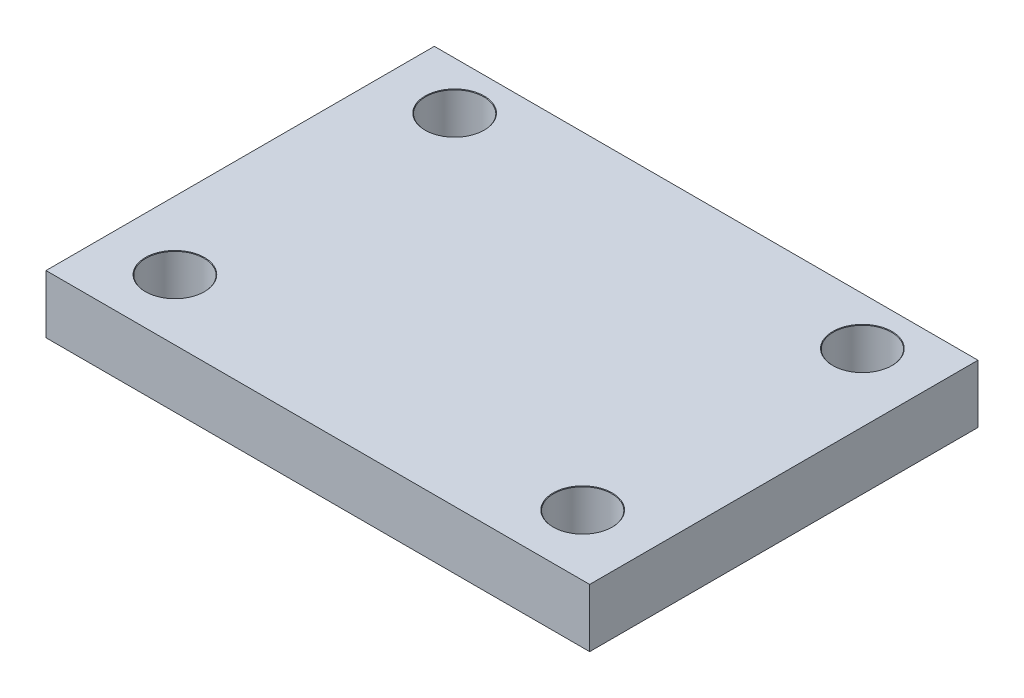
ISO-10303-21;
HEADER;
FILE_DESCRIPTION(('STEP AP214'),'2;1');
FILE_NAME('part.step','',(''),(''),'','','');
FILE_SCHEMA(('AUTOMOTIVE_DESIGN { 1 0 10303 214 1 1 1 1 }'));
ENDSEC;
DATA;
#1=APPLICATION_CONTEXT('core data for automotive mechanical design processes');
#2=APPLICATION_PROTOCOL_DEFINITION('international standard','automotive_design',2000,#1);
#3=PRODUCT_CONTEXT('',#1,'mechanical');
#4=PRODUCT('Part','Part','',(#3));
#5=PRODUCT_RELATED_PRODUCT_CATEGORY('part','',(#4));
#6=PRODUCT_DEFINITION_FORMATION('','',#4);
#7=PRODUCT_DEFINITION_CONTEXT('part definition',#1,'design');
#8=PRODUCT_DEFINITION('design','',#6,#7);
#9=PRODUCT_DEFINITION_SHAPE('','',#8);
#10=(LENGTH_UNIT() NAMED_UNIT(*) SI_UNIT(.MILLI.,.METRE.));
#11=(NAMED_UNIT(*) PLANE_ANGLE_UNIT() SI_UNIT($,.RADIAN.));
#12=(NAMED_UNIT(*) SI_UNIT($,.STERADIAN.) SOLID_ANGLE_UNIT());
#13=UNCERTAINTY_MEASURE_WITH_UNIT(LENGTH_MEASURE(1.E-05),#10,'distance_accuracy_value','');
#14=(GEOMETRIC_REPRESENTATION_CONTEXT(3) GLOBAL_UNCERTAINTY_ASSIGNED_CONTEXT((#13)) GLOBAL_UNIT_ASSIGNED_CONTEXT((#10,
#11,#12)) REPRESENTATION_CONTEXT('',''));
#15=CARTESIAN_POINT('',(0.,0.,0.));
#16=DIRECTION('',(0.,0.,1.));
#17=DIRECTION('',(1.,0.,0.));
#18=AXIS2_PLACEMENT_3D('',#15,#16,#17);
#19=CARTESIAN_POINT('',(14.,-3.,10.));
#20=DIRECTION('',(1.,0.,0.));
#21=DIRECTION('',(0.,0.,-1.));
#22=AXIS2_PLACEMENT_3D('',#19,#20,#21);
#23=PLANE('',#22);
#24=DIRECTION('',(0.,0.,-1.));
#25=VECTOR('',#24,1.);
#26=CARTESIAN_POINT('',(14.,0.,10.));
#27=LINE('',#26,#25);
#28=CARTESIAN_POINT('',(14.,0.,10.));
#29=VERTEX_POINT('',#28);
#30=CARTESIAN_POINT('',(14.,0.,-10.));
#31=VERTEX_POINT('',#30);
#32=EDGE_CURVE('E118',#29,#31,#27,.T.);
#33=ORIENTED_EDGE('',*,*,#32,.F.);
#34=DIRECTION('',(0.,1.,0.));
#35=VECTOR('',#34,1.);
#36=CARTESIAN_POINT('',(14.,-3.,10.));
#37=LINE('',#36,#35);
#38=CARTESIAN_POINT('',(14.,-3.,10.));
#39=VERTEX_POINT('',#38);
#40=EDGE_CURVE('E11',#39,#29,#37,.T.);
#41=ORIENTED_EDGE('',*,*,#40,.F.);
#42=DIRECTION('',(0.,0.,-1.));
#43=VECTOR('',#42,1.);
#44=CARTESIAN_POINT('',(14.,-3.,10.));
#45=LINE('',#44,#43);
#46=CARTESIAN_POINT('',(14.,-3.,-10.));
#47=VERTEX_POINT('',#46);
#48=EDGE_CURVE('E109',#39,#47,#45,.T.);
#49=ORIENTED_EDGE('',*,*,#48,.T.);
#50=DIRECTION('',(0.,1.,0.));
#51=VECTOR('',#50,1.);
#52=CARTESIAN_POINT('',(14.,-3.,-10.));
#53=LINE('',#52,#51);
#54=EDGE_CURVE('E50',#47,#31,#53,.T.);
#55=ORIENTED_EDGE('',*,*,#54,.T.);
#56=EDGE_LOOP('',(#33,#41,#49,#55));
#57=FACE_BOUND('',#56,.T.);
#58=ADVANCED_FACE('F47',(#57),#23,.T.);
#59=CARTESIAN_POINT('',(-14.,-3.,9.99999999999999));
#60=DIRECTION('',(0.,0.,1.));
#61=DIRECTION('',(1.,0.,0.));
#62=AXIS2_PLACEMENT_3D('',#59,#60,#61);
#63=PLANE('',#62);
#64=DIRECTION('',(1.,0.,0.));
#65=VECTOR('',#64,1.);
#66=CARTESIAN_POINT('',(-14.,0.,9.99999999999999));
#67=LINE('',#66,#65);
#68=CARTESIAN_POINT('',(-14.,0.,9.99999999999999));
#69=VERTEX_POINT('',#68);
#70=EDGE_CURVE('E112',#69,#29,#67,.T.);
#71=ORIENTED_EDGE('',*,*,#70,.F.);
#72=DIRECTION('',(0.,1.,0.));
#73=VECTOR('',#72,1.);
#74=CARTESIAN_POINT('',(-14.,-3.,9.99999999999999));
#75=LINE('',#74,#73);
#76=CARTESIAN_POINT('',(-14.,-3.,9.99999999999999));
#77=VERTEX_POINT('',#76);
#78=EDGE_CURVE('E57',#77,#69,#75,.T.);
#79=ORIENTED_EDGE('',*,*,#78,.F.);
#80=DIRECTION('',(1.,0.,0.));
#81=VECTOR('',#80,1.);
#82=CARTESIAN_POINT('',(-14.,-3.,9.99999999999999));
#83=LINE('',#82,#81);
#84=EDGE_CURVE('E104',#77,#39,#83,.T.);
#85=ORIENTED_EDGE('',*,*,#84,.T.);
#86=ORIENTED_EDGE('',*,*,#40,.T.);
#87=EDGE_LOOP('',(#71,#79,#85,#86));
#88=FACE_BOUND('',#87,.T.);
#89=ADVANCED_FACE('F135',(#88),#63,.T.);
#90=CARTESIAN_POINT('',(-14.,-3.,9.99999999999999));
#91=DIRECTION('',(-1.,0.,0.));
#92=DIRECTION('',(0.,0.,1.));
#93=AXIS2_PLACEMENT_3D('',#90,#91,#92);
#94=PLANE('',#93);
#95=DIRECTION('',(0.,0.,1.));
#96=VECTOR('',#95,1.);
#97=CARTESIAN_POINT('',(-14.,0.,9.99999999999999));
#98=LINE('',#97,#96);
#99=CARTESIAN_POINT('',(-14.,0.,-10.));
#100=VERTEX_POINT('',#99);
#101=EDGE_CURVE('E98',#100,#69,#98,.T.);
#102=ORIENTED_EDGE('',*,*,#101,.F.);
#103=DIRECTION('',(0.,1.,0.));
#104=VECTOR('',#103,1.);
#105=CARTESIAN_POINT('',(-14.,-3.,-10.));
#106=LINE('',#105,#104);
#107=CARTESIAN_POINT('',(-14.,-3.,-10.));
#108=VERTEX_POINT('',#107);
#109=EDGE_CURVE('E93',#108,#100,#106,.T.);
#110=ORIENTED_EDGE('',*,*,#109,.F.);
#111=DIRECTION('',(0.,0.,1.));
#112=VECTOR('',#111,1.);
#113=CARTESIAN_POINT('',(-14.,-3.,9.99999999999999));
#114=LINE('',#113,#112);
#115=EDGE_CURVE('E96',#108,#77,#114,.T.);
#116=ORIENTED_EDGE('',*,*,#115,.T.);
#117=ORIENTED_EDGE('',*,*,#78,.T.);
#118=EDGE_LOOP('',(#102,#110,#116,#117));
#119=FACE_BOUND('',#118,.T.);
#120=ADVANCED_FACE('F95',(#119),#94,.T.);
#121=CARTESIAN_POINT('',(-14.,-3.,-10.));
#122=DIRECTION('',(0.,0.,-1.));
#123=DIRECTION('',(-1.,0.,0.));
#124=AXIS2_PLACEMENT_3D('',#121,#122,#123);
#125=PLANE('',#124);
#126=DIRECTION('',(-1.,0.,0.));
#127=VECTOR('',#126,1.);
#128=CARTESIAN_POINT('',(-14.,0.,-10.));
#129=LINE('',#128,#127);
#130=EDGE_CURVE('E122',#31,#100,#129,.T.);
#131=ORIENTED_EDGE('',*,*,#130,.F.);
#132=ORIENTED_EDGE('',*,*,#54,.F.);
#133=DIRECTION('',(-1.,0.,0.));
#134=VECTOR('',#133,1.);
#135=CARTESIAN_POINT('',(-14.,-3.,-10.));
#136=LINE('',#135,#134);
#137=EDGE_CURVE('E103',#47,#108,#136,.T.);
#138=ORIENTED_EDGE('',*,*,#137,.T.);
#139=ORIENTED_EDGE('',*,*,#109,.T.);
#140=EDGE_LOOP('',(#131,#132,#138,#139));
#141=FACE_BOUND('',#140,.T.);
#142=ADVANCED_FACE('F107',(#141),#125,.T.);
#143=CARTESIAN_POINT('',(0.,-3.,0.));
#144=DIRECTION('',(0.,-1.,0.));
#145=DIRECTION('',(0.,0.,-1.));
#146=AXIS2_PLACEMENT_3D('',#143,#144,#145);
#147=PLANE('',#146);
#148=CARTESIAN_POINT('',(-10.5,-3.,-7.54555346909425));
#149=DIRECTION('',(0.,1.,0.));
#150=DIRECTION('',(0.,0.,1.));
#151=AXIS2_PLACEMENT_3D('',#148,#149,#150);
#152=CIRCLE('',#151,1.49999999999999);
#153=CARTESIAN_POINT('',(-10.5,-3.,-6.04555346909426));
#154=VERTEX_POINT('',#153);
#155=EDGE_CURVE('E200',#154,#154,#152,.T.);
#156=ORIENTED_EDGE('',*,*,#155,.T.);
#157=EDGE_LOOP('',(#156));
#158=FACE_BOUND('',#157,.T.);
#159=CARTESIAN_POINT('',(10.5,-3.,-7.54555346909425));
#160=DIRECTION('',(0.,1.,0.));
#161=DIRECTION('',(0.,0.,1.));
#162=AXIS2_PLACEMENT_3D('',#159,#160,#161);
#163=CIRCLE('',#162,1.49999999999999);
#164=CARTESIAN_POINT('',(10.5,-3.,-6.04555346909427));
#165=VERTEX_POINT('',#164);
#166=EDGE_CURVE('E213',#165,#165,#163,.T.);
#167=ORIENTED_EDGE('',*,*,#166,.T.);
#168=EDGE_LOOP('',(#167));
#169=FACE_BOUND('',#168,.T.);
#170=CARTESIAN_POINT('',(10.5,-3.,6.86050448722339));
#171=DIRECTION('',(0.,1.,0.));
#172=DIRECTION('',(0.,0.,1.));
#173=AXIS2_PLACEMENT_3D('',#170,#171,#172);
#174=CIRCLE('',#173,1.49999999999999);
#175=CARTESIAN_POINT('',(10.5,-3.,8.36050448722338));
#176=VERTEX_POINT('',#175);
#177=EDGE_CURVE('E225',#176,#176,#174,.T.);
#178=ORIENTED_EDGE('',*,*,#177,.T.);
#179=EDGE_LOOP('',(#178));
#180=FACE_BOUND('',#179,.T.);
#181=CARTESIAN_POINT('',(-10.5,-3.,6.86050448722339));
#182=DIRECTION('',(0.,1.,0.));
#183=DIRECTION('',(0.,0.,1.));
#184=AXIS2_PLACEMENT_3D('',#181,#182,#183);
#185=CIRCLE('',#184,1.49999999999999);
#186=CARTESIAN_POINT('',(-10.5,-3.,8.36050448722338));
#187=VERTEX_POINT('',#186);
#188=EDGE_CURVE('E123',#187,#187,#185,.T.);
#189=ORIENTED_EDGE('',*,*,#188,.T.);
#190=EDGE_LOOP('',(#189));
#191=FACE_BOUND('',#190,.T.);
#192=ORIENTED_EDGE('',*,*,#48,.F.);
#193=ORIENTED_EDGE('',*,*,#84,.F.);
#194=ORIENTED_EDGE('',*,*,#115,.F.);
#195=ORIENTED_EDGE('',*,*,#137,.F.);
#196=EDGE_LOOP('',(#192,#193,#194,#195));
#197=FACE_BOUND('',#196,.T.);
#198=ADVANCED_FACE('F102',(#158,#169,#180,#191,#197),#147,.T.);
#199=CARTESIAN_POINT('',(0.,0.,0.));
#200=DIRECTION('',(0.,-1.,0.));
#201=DIRECTION('',(0.,0.,-1.));
#202=AXIS2_PLACEMENT_3D('',#199,#200,#201);
#203=PLANE('',#202);
#204=CARTESIAN_POINT('',(-10.5,0.,-7.54555346909425));
#205=DIRECTION('',(0.,1.,0.));
#206=DIRECTION('',(0.,0.,1.));
#207=AXIS2_PLACEMENT_3D('',#204,#205,#206);
#208=CIRCLE('',#207,1.525);
#209=CARTESIAN_POINT('',(-10.5,0.,-6.02055346909425));
#210=VERTEX_POINT('',#209);
#211=EDGE_CURVE('E196',#210,#210,#208,.T.);
#212=ORIENTED_EDGE('',*,*,#211,.F.);
#213=EDGE_LOOP('',(#212));
#214=FACE_BOUND('',#213,.T.);
#215=CARTESIAN_POINT('',(10.5,0.,-7.54555346909425));
#216=DIRECTION('',(0.,1.,0.));
#217=DIRECTION('',(0.,0.,1.));
#218=AXIS2_PLACEMENT_3D('',#215,#216,#217);
#219=CIRCLE('',#218,1.525);
#220=CARTESIAN_POINT('',(10.5,0.,-6.02055346909425));
#221=VERTEX_POINT('',#220);
#222=EDGE_CURVE('E205',#221,#221,#219,.T.);
#223=ORIENTED_EDGE('',*,*,#222,.F.);
#224=EDGE_LOOP('',(#223));
#225=FACE_BOUND('',#224,.T.);
#226=CARTESIAN_POINT('',(10.5,0.,6.86050448722339));
#227=DIRECTION('',(0.,1.,0.));
#228=DIRECTION('',(0.,0.,1.));
#229=AXIS2_PLACEMENT_3D('',#226,#227,#228);
#230=CIRCLE('',#229,1.525);
#231=CARTESIAN_POINT('',(10.5,0.,8.38550448722339));
#232=VERTEX_POINT('',#231);
#233=EDGE_CURVE('E217',#232,#232,#230,.T.);
#234=ORIENTED_EDGE('',*,*,#233,.F.);
#235=EDGE_LOOP('',(#234));
#236=FACE_BOUND('',#235,.T.);
#237=CARTESIAN_POINT('',(-10.5,0.,6.86050448722339));
#238=DIRECTION('',(0.,1.,0.));
#239=DIRECTION('',(0.,0.,1.));
#240=AXIS2_PLACEMENT_3D('',#237,#238,#239);
#241=CIRCLE('',#240,1.525);
#242=CARTESIAN_POINT('',(-10.5,0.,8.38550448722339));
#243=VERTEX_POINT('',#242);
#244=EDGE_CURVE('E229',#243,#243,#241,.T.);
#245=ORIENTED_EDGE('',*,*,#244,.F.);
#246=EDGE_LOOP('',(#245));
#247=FACE_BOUND('',#246,.T.);
#248=ORIENTED_EDGE('',*,*,#32,.T.);
#249=ORIENTED_EDGE('',*,*,#130,.T.);
#250=ORIENTED_EDGE('',*,*,#101,.T.);
#251=ORIENTED_EDGE('',*,*,#70,.T.);
#252=EDGE_LOOP('',(#248,#249,#250,#251));
#253=FACE_BOUND('',#252,.T.);
#254=ADVANCED_FACE('F134',(#214,#225,#236,#247,#253),#203,.F.);
#255=CARTESIAN_POINT('',(-10.5,0.,6.86050448722339));
#256=DIRECTION('',(0.,1.,0.));
#257=DIRECTION('',(0.,0.,1.));
#258=AXIS2_PLACEMENT_3D('',#255,#256,#257);
#259=CYLINDRICAL_SURFACE('',#258,1.49999999999999);
#260=ORIENTED_EDGE('',*,*,#188,.F.);
#261=EDGE_LOOP('',(#260));
#262=FACE_BOUND('',#261,.T.);
#263=CARTESIAN_POINT('',(-10.5,-0.0250000000000111,6.86050448722339));
#264=DIRECTION('',(0.,1.,0.));
#265=DIRECTION('',(0.,0.,1.));
#266=AXIS2_PLACEMENT_3D('',#263,#264,#265);
#267=CIRCLE('',#266,1.49999999999999);
#268=CARTESIAN_POINT('',(-10.5,-0.0250000000000111,8.36050448722338));
#269=VERTEX_POINT('',#268);
#270=EDGE_CURVE('E233',#269,#269,#267,.T.);
#271=ORIENTED_EDGE('',*,*,#270,.T.);
#272=EDGE_LOOP('',(#271));
#273=FACE_BOUND('',#272,.T.);
#274=ADVANCED_FACE('F153',(#262,#273),#259,.F.);
#275=CARTESIAN_POINT('',(-10.5,0.,6.86050448722339));
#276=DIRECTION('',(0.,1.,0.));
#277=DIRECTION('',(0.,0.,1.));
#278=AXIS2_PLACEMENT_3D('',#275,#276,#277);
#279=CONICAL_SURFACE('',#278,1.525,0.785398163397414);
#280=ORIENTED_EDGE('',*,*,#270,.F.);
#281=EDGE_LOOP('',(#280));
#282=FACE_BOUND('',#281,.T.);
#283=ORIENTED_EDGE('',*,*,#244,.T.);
#284=EDGE_LOOP('',(#283));
#285=FACE_BOUND('',#284,.T.);
#286=ADVANCED_FACE('F160',(#282,#285),#279,.F.);
#287=CARTESIAN_POINT('',(10.5,0.,6.86050448722339));
#288=DIRECTION('',(0.,1.,0.));
#289=DIRECTION('',(0.,0.,1.));
#290=AXIS2_PLACEMENT_3D('',#287,#288,#289);
#291=CYLINDRICAL_SURFACE('',#290,1.49999999999999);
#292=ORIENTED_EDGE('',*,*,#177,.F.);
#293=EDGE_LOOP('',(#292));
#294=FACE_BOUND('',#293,.T.);
#295=CARTESIAN_POINT('',(10.5,-0.0250000000000111,6.86050448722339));
#296=DIRECTION('',(0.,1.,0.));
#297=DIRECTION('',(0.,0.,1.));
#298=AXIS2_PLACEMENT_3D('',#295,#296,#297);
#299=CIRCLE('',#298,1.49999999999999);
#300=CARTESIAN_POINT('',(10.5,-0.0250000000000111,8.36050448722338));
#301=VERTEX_POINT('',#300);
#302=EDGE_CURVE('E221',#301,#301,#299,.T.);
#303=ORIENTED_EDGE('',*,*,#302,.T.);
#304=EDGE_LOOP('',(#303));
#305=FACE_BOUND('',#304,.T.);
#306=ADVANCED_FACE('F164',(#294,#305),#291,.F.);
#307=CARTESIAN_POINT('',(10.5,0.,6.86050448722339));
#308=DIRECTION('',(0.,1.,0.));
#309=DIRECTION('',(0.,0.,1.));
#310=AXIS2_PLACEMENT_3D('',#307,#308,#309);
#311=CONICAL_SURFACE('',#310,1.525,0.785398163397414);
#312=ORIENTED_EDGE('',*,*,#302,.F.);
#313=EDGE_LOOP('',(#312));
#314=FACE_BOUND('',#313,.T.);
#315=ORIENTED_EDGE('',*,*,#233,.T.);
#316=EDGE_LOOP('',(#315));
#317=FACE_BOUND('',#316,.T.);
#318=ADVANCED_FACE('F168',(#314,#317),#311,.F.);
#319=CARTESIAN_POINT('',(10.5,0.,-7.54555346909425));
#320=DIRECTION('',(0.,1.,0.));
#321=DIRECTION('',(0.,0.,1.));
#322=AXIS2_PLACEMENT_3D('',#319,#320,#321);
#323=CYLINDRICAL_SURFACE('',#322,1.49999999999999);
#324=ORIENTED_EDGE('',*,*,#166,.F.);
#325=EDGE_LOOP('',(#324));
#326=FACE_BOUND('',#325,.T.);
#327=CARTESIAN_POINT('',(10.5,-0.0250000000000111,-7.54555346909425));
#328=DIRECTION('',(0.,1.,0.));
#329=DIRECTION('',(0.,0.,1.));
#330=AXIS2_PLACEMENT_3D('',#327,#328,#329);
#331=CIRCLE('',#330,1.49999999999999);
#332=CARTESIAN_POINT('',(10.5,-0.0250000000000111,-6.04555346909427));
#333=VERTEX_POINT('',#332);
#334=EDGE_CURVE('E209',#333,#333,#331,.T.);
#335=ORIENTED_EDGE('',*,*,#334,.T.);
#336=EDGE_LOOP('',(#335));
#337=FACE_BOUND('',#336,.T.);
#338=ADVANCED_FACE('F172',(#326,#337),#323,.F.);
#339=CARTESIAN_POINT('',(10.5,0.,-7.54555346909425));
#340=DIRECTION('',(0.,1.,0.));
#341=DIRECTION('',(0.,0.,1.));
#342=AXIS2_PLACEMENT_3D('',#339,#340,#341);
#343=CONICAL_SURFACE('',#342,1.525,0.785398163397414);
#344=ORIENTED_EDGE('',*,*,#334,.F.);
#345=EDGE_LOOP('',(#344));
#346=FACE_BOUND('',#345,.T.);
#347=ORIENTED_EDGE('',*,*,#222,.T.);
#348=EDGE_LOOP('',(#347));
#349=FACE_BOUND('',#348,.T.);
#350=ADVANCED_FACE('F176',(#346,#349),#343,.F.);
#351=CARTESIAN_POINT('',(-10.5,0.,-7.54555346909425));
#352=DIRECTION('',(0.,1.,0.));
#353=DIRECTION('',(0.,0.,1.));
#354=AXIS2_PLACEMENT_3D('',#351,#352,#353);
#355=CYLINDRICAL_SURFACE('',#354,1.49999999999999);
#356=ORIENTED_EDGE('',*,*,#155,.F.);
#357=EDGE_LOOP('',(#356));
#358=FACE_BOUND('',#357,.T.);
#359=CARTESIAN_POINT('',(-10.5,-0.0250000000000111,-7.54555346909425));
#360=DIRECTION('',(0.,1.,0.));
#361=DIRECTION('',(0.,0.,1.));
#362=AXIS2_PLACEMENT_3D('',#359,#360,#361);
#363=CIRCLE('',#362,1.49999999999999);
#364=CARTESIAN_POINT('',(-10.5,-0.0250000000000111,-6.04555346909426));
#365=VERTEX_POINT('',#364);
#366=EDGE_CURVE('E193',#365,#365,#363,.T.);
#367=ORIENTED_EDGE('',*,*,#366,.T.);
#368=EDGE_LOOP('',(#367));
#369=FACE_BOUND('',#368,.T.);
#370=ADVANCED_FACE('F180',(#358,#369),#355,.F.);
#371=CARTESIAN_POINT('',(-10.5,0.,-7.54555346909425));
#372=DIRECTION('',(0.,1.,0.));
#373=DIRECTION('',(0.,0.,1.));
#374=AXIS2_PLACEMENT_3D('',#371,#372,#373);
#375=CONICAL_SURFACE('',#374,1.525,0.785398163397414);
#376=ORIENTED_EDGE('',*,*,#366,.F.);
#377=EDGE_LOOP('',(#376));
#378=FACE_BOUND('',#377,.T.);
#379=ORIENTED_EDGE('',*,*,#211,.T.);
#380=EDGE_LOOP('',(#379));
#381=FACE_BOUND('',#380,.T.);
#382=ADVANCED_FACE('F184',(#378,#381),#375,.F.);
#383=CLOSED_SHELL('',(#58,#89,#120,#142,#198,#254,#274,#286,#306,#318,#338,#350,#370,#382));
#384=MANIFOLD_SOLID_BREP('B2',#383);
#385=ADVANCED_BREP_SHAPE_REPRESENTATION('',(#18,#384),#14);
#386=SHAPE_DEFINITION_REPRESENTATION(#9,#385);
ENDSEC;
END-ISO-10303-21;
